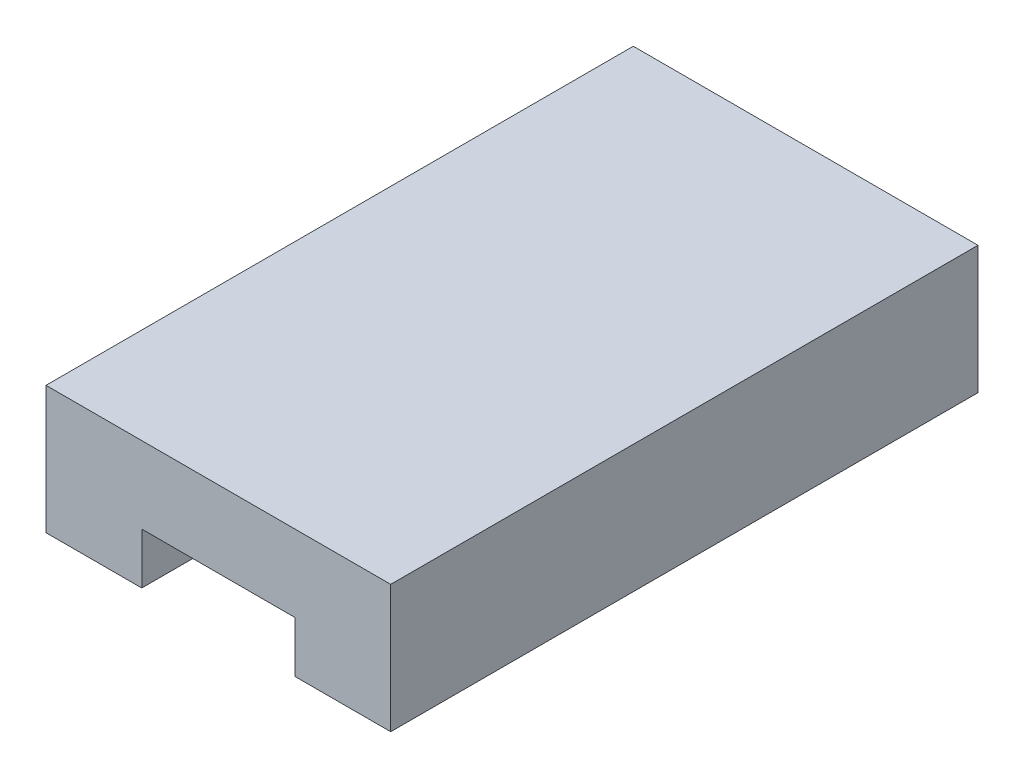
ISO-10303-21;
HEADER;
FILE_DESCRIPTION(('STEP AP214'),'2;1');
FILE_NAME('part.step','',(''),(''),'','','');
FILE_SCHEMA(('AUTOMOTIVE_DESIGN { 1 0 10303 214 1 1 1 1 }'));
ENDSEC;
DATA;
#1=APPLICATION_CONTEXT('core data for automotive mechanical design processes');
#2=APPLICATION_PROTOCOL_DEFINITION('international standard','automotive_design',2000,#1);
#3=PRODUCT_CONTEXT('',#1,'mechanical');
#4=PRODUCT('Part','Part','',(#3));
#5=PRODUCT_RELATED_PRODUCT_CATEGORY('part','',(#4));
#6=PRODUCT_DEFINITION_FORMATION('','',#4);
#7=PRODUCT_DEFINITION_CONTEXT('part definition',#1,'design');
#8=PRODUCT_DEFINITION('design','',#6,#7);
#9=PRODUCT_DEFINITION_SHAPE('','',#8);
#10=(LENGTH_UNIT() NAMED_UNIT(*) SI_UNIT(.MILLI.,.METRE.));
#11=(NAMED_UNIT(*) PLANE_ANGLE_UNIT() SI_UNIT($,.RADIAN.));
#12=(NAMED_UNIT(*) SI_UNIT($,.STERADIAN.) SOLID_ANGLE_UNIT());
#13=UNCERTAINTY_MEASURE_WITH_UNIT(LENGTH_MEASURE(1.E-05),#10,'distance_accuracy_value','');
#14=(GEOMETRIC_REPRESENTATION_CONTEXT(3) GLOBAL_UNCERTAINTY_ASSIGNED_CONTEXT((#13)) GLOBAL_UNIT_ASSIGNED_CONTEXT((#10,
#11,#12)) REPRESENTATION_CONTEXT('',''));
#15=CARTESIAN_POINT('',(0.,0.,0.));
#16=DIRECTION('',(0.,0.,1.));
#17=DIRECTION('',(1.,0.,0.));
#18=AXIS2_PLACEMENT_3D('',#15,#16,#17);
#19=CARTESIAN_POINT('',(0.,0.,46.));
#20=DIRECTION('',(1.,0.,0.));
#21=DIRECTION('',(0.,0.,-1.));
#22=AXIS2_PLACEMENT_3D('',#19,#20,#21);
#23=PLANE('',#22);
#24=DIRECTION('',(0.,-1.,0.));
#25=VECTOR('',#24,1.);
#26=CARTESIAN_POINT('',(0.,0.,0.));
#27=LINE('',#26,#25);
#28=CARTESIAN_POINT('',(0.,10.,0.));
#29=VERTEX_POINT('',#28);
#30=CARTESIAN_POINT('',(0.,0.,0.));
#31=VERTEX_POINT('',#30);
#32=EDGE_CURVE('E131',#29,#31,#27,.T.);
#33=ORIENTED_EDGE('',*,*,#32,.T.);
#34=DIRECTION('',(0.,0.,-1.));
#35=VECTOR('',#34,1.);
#36=CARTESIAN_POINT('',(0.,0.,46.));
#37=LINE('',#36,#35);
#38=CARTESIAN_POINT('',(0.,0.,46.));
#39=VERTEX_POINT('',#38);
#40=EDGE_CURVE('E11',#39,#31,#37,.T.);
#41=ORIENTED_EDGE('',*,*,#40,.F.);
#42=DIRECTION('',(0.,-1.,0.));
#43=VECTOR('',#42,1.);
#44=CARTESIAN_POINT('',(0.,0.,46.));
#45=LINE('',#44,#43);
#46=CARTESIAN_POINT('',(0.,10.,46.));
#47=VERTEX_POINT('',#46);
#48=EDGE_CURVE('E145',#47,#39,#45,.T.);
#49=ORIENTED_EDGE('',*,*,#48,.F.);
#50=DIRECTION('',(0.,0.,-1.));
#51=VECTOR('',#50,1.);
#52=CARTESIAN_POINT('',(0.,10.,46.));
#53=LINE('',#52,#51);
#54=EDGE_CURVE('E127',#47,#29,#53,.T.);
#55=ORIENTED_EDGE('',*,*,#54,.T.);
#56=EDGE_LOOP('',(#33,#41,#49,#55));
#57=FACE_BOUND('',#56,.T.);
#58=ADVANCED_FACE('F35',(#57),#23,.F.);
#59=CARTESIAN_POINT('',(0.,0.,46.));
#60=DIRECTION('',(0.,1.,0.));
#61=DIRECTION('',(0.,0.,1.));
#62=AXIS2_PLACEMENT_3D('',#59,#60,#61);
#63=PLANE('',#62);
#64=DIRECTION('',(1.,0.,0.));
#65=VECTOR('',#64,1.);
#66=CARTESIAN_POINT('',(0.,0.,0.));
#67=LINE('',#66,#65);
#68=CARTESIAN_POINT('',(7.5,0.,0.));
#69=VERTEX_POINT('',#68);
#70=EDGE_CURVE('E134',#31,#69,#67,.T.);
#71=ORIENTED_EDGE('',*,*,#70,.T.);
#72=DIRECTION('',(0.,0.,-1.));
#73=VECTOR('',#72,1.);
#74=CARTESIAN_POINT('',(7.5,0.,46.));
#75=LINE('',#74,#73);
#76=CARTESIAN_POINT('',(7.5,0.,46.));
#77=VERTEX_POINT('',#76);
#78=EDGE_CURVE('E43',#77,#69,#75,.T.);
#79=ORIENTED_EDGE('',*,*,#78,.F.);
#80=DIRECTION('',(1.,0.,0.));
#81=VECTOR('',#80,1.);
#82=CARTESIAN_POINT('',(0.,0.,46.));
#83=LINE('',#82,#81);
#84=EDGE_CURVE('E94',#39,#77,#83,.T.);
#85=ORIENTED_EDGE('',*,*,#84,.F.);
#86=ORIENTED_EDGE('',*,*,#40,.T.);
#87=EDGE_LOOP('',(#71,#79,#85,#86));
#88=FACE_BOUND('',#87,.T.);
#89=ADVANCED_FACE('F180',(#88),#63,.F.);
#90=CARTESIAN_POINT('',(7.5,0.,46.));
#91=DIRECTION('',(-1.,0.,0.));
#92=DIRECTION('',(0.,0.,1.));
#93=AXIS2_PLACEMENT_3D('',#90,#91,#92);
#94=PLANE('',#93);
#95=DIRECTION('',(0.,1.,0.));
#96=VECTOR('',#95,1.);
#97=CARTESIAN_POINT('',(7.5,0.,0.));
#98=LINE('',#97,#96);
#99=CARTESIAN_POINT('',(7.5,4.,0.));
#100=VERTEX_POINT('',#99);
#101=EDGE_CURVE('E136',#69,#100,#98,.T.);
#102=ORIENTED_EDGE('',*,*,#101,.T.);
#103=DIRECTION('',(0.,0.,-1.));
#104=VECTOR('',#103,1.);
#105=CARTESIAN_POINT('',(7.5,4.,46.));
#106=LINE('',#105,#104);
#107=CARTESIAN_POINT('',(7.5,4.,46.));
#108=VERTEX_POINT('',#107);
#109=EDGE_CURVE('E152',#108,#100,#106,.T.);
#110=ORIENTED_EDGE('',*,*,#109,.F.);
#111=DIRECTION('',(0.,1.,0.));
#112=VECTOR('',#111,1.);
#113=CARTESIAN_POINT('',(7.5,0.,46.));
#114=LINE('',#113,#112);
#115=EDGE_CURVE('E160',#77,#108,#114,.T.);
#116=ORIENTED_EDGE('',*,*,#115,.F.);
#117=ORIENTED_EDGE('',*,*,#78,.T.);
#118=EDGE_LOOP('',(#102,#110,#116,#117));
#119=FACE_BOUND('',#118,.T.);
#120=ADVANCED_FACE('F158',(#119),#94,.F.);
#121=CARTESIAN_POINT('',(7.5,4.,46.));
#122=DIRECTION('',(0.,1.,0.));
#123=DIRECTION('',(0.,0.,1.));
#124=AXIS2_PLACEMENT_3D('',#121,#122,#123);
#125=PLANE('',#124);
#126=DIRECTION('',(1.,0.,0.));
#127=VECTOR('',#126,1.);
#128=CARTESIAN_POINT('',(7.5,4.,0.));
#129=LINE('',#128,#127);
#130=CARTESIAN_POINT('',(19.5,4.,0.));
#131=VERTEX_POINT('',#130);
#132=EDGE_CURVE('E138',#100,#131,#129,.T.);
#133=ORIENTED_EDGE('',*,*,#132,.T.);
#134=DIRECTION('',(0.,0.,-1.));
#135=VECTOR('',#134,1.);
#136=CARTESIAN_POINT('',(19.5,4.,46.));
#137=LINE('',#136,#135);
#138=CARTESIAN_POINT('',(19.5,4.,46.));
#139=VERTEX_POINT('',#138);
#140=EDGE_CURVE('E149',#139,#131,#137,.T.);
#141=ORIENTED_EDGE('',*,*,#140,.F.);
#142=DIRECTION('',(1.,0.,0.));
#143=VECTOR('',#142,1.);
#144=CARTESIAN_POINT('',(7.5,4.,46.));
#145=LINE('',#144,#143);
#146=EDGE_CURVE('E172',#108,#139,#145,.T.);
#147=ORIENTED_EDGE('',*,*,#146,.F.);
#148=ORIENTED_EDGE('',*,*,#109,.T.);
#149=EDGE_LOOP('',(#133,#141,#147,#148));
#150=FACE_BOUND('',#149,.T.);
#151=ADVANCED_FACE('F168',(#150),#125,.F.);
#152=CARTESIAN_POINT('',(19.5,0.,46.));
#153=DIRECTION('',(1.,0.,0.));
#154=DIRECTION('',(0.,0.,-1.));
#155=AXIS2_PLACEMENT_3D('',#152,#153,#154);
#156=PLANE('',#155);
#157=DIRECTION('',(0.,-1.,0.));
#158=VECTOR('',#157,1.);
#159=CARTESIAN_POINT('',(19.5,0.,0.));
#160=LINE('',#159,#158);
#161=CARTESIAN_POINT('',(19.5,0.,0.));
#162=VERTEX_POINT('',#161);
#163=EDGE_CURVE('E140',#131,#162,#160,.T.);
#164=ORIENTED_EDGE('',*,*,#163,.T.);
#165=DIRECTION('',(0.,0.,-1.));
#166=VECTOR('',#165,1.);
#167=CARTESIAN_POINT('',(19.5,0.,46.));
#168=LINE('',#167,#166);
#169=CARTESIAN_POINT('',(19.5,0.,46.));
#170=VERTEX_POINT('',#169);
#171=EDGE_CURVE('E122',#170,#162,#168,.T.);
#172=ORIENTED_EDGE('',*,*,#171,.F.);
#173=DIRECTION('',(0.,-1.,0.));
#174=VECTOR('',#173,1.);
#175=CARTESIAN_POINT('',(19.5,0.,46.));
#176=LINE('',#175,#174);
#177=EDGE_CURVE('E113',#139,#170,#176,.T.);
#178=ORIENTED_EDGE('',*,*,#177,.F.);
#179=ORIENTED_EDGE('',*,*,#140,.T.);
#180=EDGE_LOOP('',(#164,#172,#178,#179));
#181=FACE_BOUND('',#180,.T.);
#182=ADVANCED_FACE('F171',(#181),#156,.F.);
#183=CARTESIAN_POINT('',(19.5,0.,46.));
#184=DIRECTION('',(0.,1.,0.));
#185=DIRECTION('',(0.,0.,1.));
#186=AXIS2_PLACEMENT_3D('',#183,#184,#185);
#187=PLANE('',#186);
#188=DIRECTION('',(1.,0.,0.));
#189=VECTOR('',#188,1.);
#190=CARTESIAN_POINT('',(19.5,0.,0.));
#191=LINE('',#190,#189);
#192=CARTESIAN_POINT('',(27.,0.,0.));
#193=VERTEX_POINT('',#192);
#194=EDGE_CURVE('E121',#162,#193,#191,.T.);
#195=ORIENTED_EDGE('',*,*,#194,.T.);
#196=DIRECTION('',(0.,0.,-1.));
#197=VECTOR('',#196,1.);
#198=CARTESIAN_POINT('',(27.,0.,46.));
#199=LINE('',#198,#197);
#200=CARTESIAN_POINT('',(27.,0.,46.));
#201=VERTEX_POINT('',#200);
#202=EDGE_CURVE('E118',#201,#193,#199,.T.);
#203=ORIENTED_EDGE('',*,*,#202,.F.);
#204=DIRECTION('',(1.,0.,0.));
#205=VECTOR('',#204,1.);
#206=CARTESIAN_POINT('',(19.5,0.,46.));
#207=LINE('',#206,#205);
#208=EDGE_CURVE('E107',#170,#201,#207,.T.);
#209=ORIENTED_EDGE('',*,*,#208,.F.);
#210=ORIENTED_EDGE('',*,*,#171,.T.);
#211=EDGE_LOOP('',(#195,#203,#209,#210));
#212=FACE_BOUND('',#211,.T.);
#213=ADVANCED_FACE('F119',(#212),#187,.F.);
#214=CARTESIAN_POINT('',(27.,0.,46.));
#215=DIRECTION('',(-1.,0.,0.));
#216=DIRECTION('',(0.,0.,1.));
#217=AXIS2_PLACEMENT_3D('',#214,#215,#216);
#218=PLANE('',#217);
#219=DIRECTION('',(0.,1.,0.));
#220=VECTOR('',#219,1.);
#221=CARTESIAN_POINT('',(27.,0.,0.));
#222=LINE('',#221,#220);
#223=CARTESIAN_POINT('',(27.,10.,0.));
#224=VERTEX_POINT('',#223);
#225=EDGE_CURVE('E80',#193,#224,#222,.T.);
#226=ORIENTED_EDGE('',*,*,#225,.T.);
#227=DIRECTION('',(0.,0.,-1.));
#228=VECTOR('',#227,1.);
#229=CARTESIAN_POINT('',(27.,10.,46.));
#230=LINE('',#229,#228);
#231=CARTESIAN_POINT('',(27.,10.,46.));
#232=VERTEX_POINT('',#231);
#233=EDGE_CURVE('E123',#232,#224,#230,.T.);
#234=ORIENTED_EDGE('',*,*,#233,.F.);
#235=DIRECTION('',(0.,1.,0.));
#236=VECTOR('',#235,1.);
#237=CARTESIAN_POINT('',(27.,0.,46.));
#238=LINE('',#237,#236);
#239=EDGE_CURVE('E111',#201,#232,#238,.T.);
#240=ORIENTED_EDGE('',*,*,#239,.F.);
#241=ORIENTED_EDGE('',*,*,#202,.T.);
#242=EDGE_LOOP('',(#226,#234,#240,#241));
#243=FACE_BOUND('',#242,.T.);
#244=ADVANCED_FACE('F125',(#243),#218,.F.);
#245=CARTESIAN_POINT('',(0.,10.,46.));
#246=DIRECTION('',(0.,-1.,0.));
#247=DIRECTION('',(0.,0.,-1.));
#248=AXIS2_PLACEMENT_3D('',#245,#246,#247);
#249=PLANE('',#248);
#250=DIRECTION('',(-1.,0.,0.));
#251=VECTOR('',#250,1.);
#252=CARTESIAN_POINT('',(0.,10.,0.));
#253=LINE('',#252,#251);
#254=EDGE_CURVE('E86',#224,#29,#253,.T.);
#255=ORIENTED_EDGE('',*,*,#254,.T.);
#256=ORIENTED_EDGE('',*,*,#54,.F.);
#257=DIRECTION('',(-1.,0.,0.));
#258=VECTOR('',#257,1.);
#259=CARTESIAN_POINT('',(0.,10.,46.));
#260=LINE('',#259,#258);
#261=EDGE_CURVE('E51',#232,#47,#260,.T.);
#262=ORIENTED_EDGE('',*,*,#261,.F.);
#263=ORIENTED_EDGE('',*,*,#233,.T.);
#264=EDGE_LOOP('',(#255,#256,#262,#263));
#265=FACE_BOUND('',#264,.T.);
#266=ADVANCED_FACE('F196',(#265),#249,.F.);
#267=CARTESIAN_POINT('',(0.,0.,46.));
#268=DIRECTION('',(0.,0.,-1.));
#269=DIRECTION('',(-1.,0.,0.));
#270=AXIS2_PLACEMENT_3D('',#267,#268,#269);
#271=PLANE('',#270);
#272=ORIENTED_EDGE('',*,*,#48,.T.);
#273=ORIENTED_EDGE('',*,*,#84,.T.);
#274=ORIENTED_EDGE('',*,*,#115,.T.);
#275=ORIENTED_EDGE('',*,*,#146,.T.);
#276=ORIENTED_EDGE('',*,*,#177,.T.);
#277=ORIENTED_EDGE('',*,*,#208,.T.);
#278=ORIENTED_EDGE('',*,*,#239,.T.);
#279=ORIENTED_EDGE('',*,*,#261,.T.);
#280=EDGE_LOOP('',(#272,#273,#274,#275,#276,#277,#278,#279));
#281=FACE_BOUND('',#280,.T.);
#282=ADVANCED_FACE('F109',(#281),#271,.F.);
#283=CARTESIAN_POINT('',(0.,0.,0.));
#284=DIRECTION('',(0.,0.,-1.));
#285=DIRECTION('',(-1.,0.,0.));
#286=AXIS2_PLACEMENT_3D('',#283,#284,#285);
#287=PLANE('',#286);
#288=ORIENTED_EDGE('',*,*,#32,.F.);
#289=ORIENTED_EDGE('',*,*,#254,.F.);
#290=ORIENTED_EDGE('',*,*,#225,.F.);
#291=ORIENTED_EDGE('',*,*,#194,.F.);
#292=ORIENTED_EDGE('',*,*,#163,.F.);
#293=ORIENTED_EDGE('',*,*,#132,.F.);
#294=ORIENTED_EDGE('',*,*,#101,.F.);
#295=ORIENTED_EDGE('',*,*,#70,.F.);
#296=EDGE_LOOP('',(#288,#289,#290,#291,#292,#293,#294,#295));
#297=FACE_BOUND('',#296,.T.);
#298=ADVANCED_FACE('F164',(#297),#287,.T.);
#299=CLOSED_SHELL('',(#58,#89,#120,#151,#182,#213,#244,#266,#282,#298));
#300=MANIFOLD_SOLID_BREP('B2',#299);
#301=ADVANCED_BREP_SHAPE_REPRESENTATION('',(#18,#300),#14);
#302=SHAPE_DEFINITION_REPRESENTATION(#9,#301);
ENDSEC;
END-ISO-10303-21;
